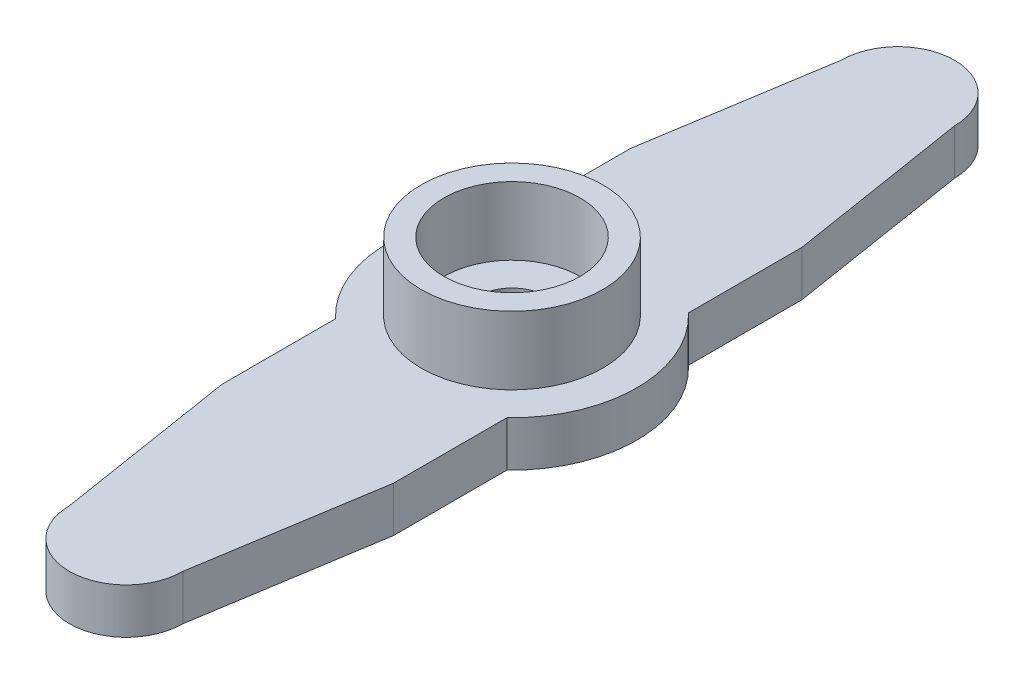
ISO-10303-21;
HEADER;
FILE_DESCRIPTION(('STEP AP214'),'2;1');
FILE_NAME('part.step','',(''),(''),'','','');
FILE_SCHEMA(('AUTOMOTIVE_DESIGN { 1 0 10303 214 1 1 1 1 }'));
ENDSEC;
DATA;
#1=APPLICATION_CONTEXT('core data for automotive mechanical design processes');
#2=APPLICATION_PROTOCOL_DEFINITION('international standard','automotive_design',2000,#1);
#3=PRODUCT_CONTEXT('',#1,'mechanical');
#4=PRODUCT('Part','Part','',(#3));
#5=PRODUCT_RELATED_PRODUCT_CATEGORY('part','',(#4));
#6=PRODUCT_DEFINITION_FORMATION('','',#4);
#7=PRODUCT_DEFINITION_CONTEXT('part definition',#1,'design');
#8=PRODUCT_DEFINITION('design','',#6,#7);
#9=PRODUCT_DEFINITION_SHAPE('','',#8);
#10=(LENGTH_UNIT() NAMED_UNIT(*) SI_UNIT(.MILLI.,.METRE.));
#11=(NAMED_UNIT(*) PLANE_ANGLE_UNIT() SI_UNIT($,.RADIAN.));
#12=(NAMED_UNIT(*) SI_UNIT($,.STERADIAN.) SOLID_ANGLE_UNIT());
#13=UNCERTAINTY_MEASURE_WITH_UNIT(LENGTH_MEASURE(1.E-05),#10,'distance_accuracy_value','');
#14=(GEOMETRIC_REPRESENTATION_CONTEXT(3) GLOBAL_UNCERTAINTY_ASSIGNED_CONTEXT((#13)) GLOBAL_UNIT_ASSIGNED_CONTEXT((#10,
#11,#12)) REPRESENTATION_CONTEXT('',''));
#15=CARTESIAN_POINT('',(0.,0.,0.));
#16=DIRECTION('',(0.,0.,1.));
#17=DIRECTION('',(1.,0.,0.));
#18=AXIS2_PLACEMENT_3D('',#15,#16,#17);
#19=CARTESIAN_POINT('',(0.,2.,0.));
#20=DIRECTION('',(0.,1.,0.));
#21=DIRECTION('',(0.,0.,1.));
#22=AXIS2_PLACEMENT_3D('',#19,#20,#21);
#23=PLANE('',#22);
#24=CARTESIAN_POINT('',(0.,2.,0.));
#25=DIRECTION('',(0.,1.,0.));
#26=DIRECTION('',(0.,0.,1.));
#27=AXIS2_PLACEMENT_3D('',#24,#25,#26);
#28=CIRCLE('',#27,1.5);
#29=CARTESIAN_POINT('',(0.,2.,1.5));
#30=VERTEX_POINT('',#29);
#31=EDGE_CURVE('E166',#30,#30,#28,.T.);
#32=ORIENTED_EDGE('',*,*,#31,.F.);
#33=EDGE_LOOP('',(#32));
#34=FACE_BOUND('',#33,.T.);
#35=CARTESIAN_POINT('',(0.,2.,0.));
#36=DIRECTION('',(0.,1.,0.));
#37=DIRECTION('',(0.,0.,1.));
#38=AXIS2_PLACEMENT_3D('',#35,#36,#37);
#39=CIRCLE('',#38,3.);
#40=CARTESIAN_POINT('',(0.,2.,3.));
#41=VERTEX_POINT('',#40);
#42=EDGE_CURVE('E11',#41,#41,#39,.F.);
#43=ORIENTED_EDGE('',*,*,#42,.F.);
#44=EDGE_LOOP('',(#43));
#45=FACE_BOUND('',#44,.T.);
#46=ADVANCED_FACE('F45',(#34,#45),#23,.T.);
#47=CARTESIAN_POINT('',(0.,2.,-17.));
#48=DIRECTION('',(0.,-1.,0.));
#49=DIRECTION('',(0.,0.,-1.));
#50=AXIS2_PLACEMENT_3D('',#47,#48,#49);
#51=CYLINDRICAL_SURFACE('',#50,2.5);
#52=CARTESIAN_POINT('',(0.,0.,-17.));
#53=DIRECTION('',(0.,1.,0.));
#54=DIRECTION('',(0.,0.,1.));
#55=AXIS2_PLACEMENT_3D('',#52,#53,#54);
#56=CIRCLE('',#55,2.5);
#57=CARTESIAN_POINT('',(-2.5,0.,-17.));
#58=VERTEX_POINT('',#57);
#59=CARTESIAN_POINT('',(2.5,0.,-17.));
#60=VERTEX_POINT('',#59);
#61=EDGE_CURVE('E174',#58,#60,#56,.F.);
#62=ORIENTED_EDGE('',*,*,#61,.F.);
#63=DIRECTION('',(0.,-1.,0.));
#64=VECTOR('',#63,1.);
#65=CARTESIAN_POINT('',(-2.5,2.,-17.));
#66=LINE('',#65,#64);
#67=CARTESIAN_POINT('',(-2.5,2.,-17.));
#68=VERTEX_POINT('',#67);
#69=EDGE_CURVE('E55',#68,#58,#66,.T.);
#70=ORIENTED_EDGE('',*,*,#69,.F.);
#71=CARTESIAN_POINT('',(0.,2.,-17.));
#72=DIRECTION('',(0.,1.,0.));
#73=DIRECTION('',(0.,0.,1.));
#74=AXIS2_PLACEMENT_3D('',#71,#72,#73);
#75=CIRCLE('',#74,2.5);
#76=CARTESIAN_POINT('',(2.5,2.,-17.));
#77=VERTEX_POINT('',#76);
#78=EDGE_CURVE('E217',#68,#77,#75,.F.);
#79=ORIENTED_EDGE('',*,*,#78,.T.);
#80=DIRECTION('',(0.,-1.,0.));
#81=VECTOR('',#80,1.);
#82=CARTESIAN_POINT('',(2.5,2.,-17.));
#83=LINE('',#82,#81);
#84=EDGE_CURVE('E111',#77,#60,#83,.T.);
#85=ORIENTED_EDGE('',*,*,#84,.T.);
#86=EDGE_LOOP('',(#62,#70,#79,#85));
#87=FACE_BOUND('',#86,.T.);
#88=ADVANCED_FACE('F47',(#87),#51,.T.);
#89=CARTESIAN_POINT('',(-5.08017735394957,2.,-0.80960069714895));
#90=DIRECTION('',(-0.987538325447718,0.,-0.157378701773512));
#91=DIRECTION('',(-0.157378701773512,0.,0.987538325447718));
#92=AXIS2_PLACEMENT_3D('',#89,#90,#91);
#93=PLANE('',#92);
#94=DIRECTION('',(0.157378701773512,0.,-0.987538325447718));
#95=VECTOR('',#94,1.);
#96=CARTESIAN_POINT('',(-5.08017735394957,0.,-0.80960069714895));
#97=LINE('',#96,#95);
#98=CARTESIAN_POINT('',(-3.77491721763537,0.,-9.));
#99=VERTEX_POINT('',#98);
#100=EDGE_CURVE('E178',#99,#58,#97,.T.);
#101=ORIENTED_EDGE('',*,*,#100,.F.);
#102=DIRECTION('',(0.,-1.,0.));
#103=VECTOR('',#102,1.);
#104=CARTESIAN_POINT('',(-3.77491721763537,2.,-9.));
#105=LINE('',#104,#103);
#106=CARTESIAN_POINT('',(-3.77491721763537,2.,-9.));
#107=VERTEX_POINT('',#106);
#108=EDGE_CURVE('E245',#107,#99,#105,.T.);
#109=ORIENTED_EDGE('',*,*,#108,.F.);
#110=DIRECTION('',(0.157378701773512,0.,-0.987538325447718));
#111=VECTOR('',#110,1.);
#112=CARTESIAN_POINT('',(-5.08017735394957,2.,-0.80960069714895));
#113=LINE('',#112,#111);
#114=EDGE_CURVE('E253',#107,#68,#113,.T.);
#115=ORIENTED_EDGE('',*,*,#114,.T.);
#116=ORIENTED_EDGE('',*,*,#69,.T.);
#117=EDGE_LOOP('',(#101,#109,#115,#116));
#118=FACE_BOUND('',#117,.T.);
#119=ADVANCED_FACE('F251',(#118),#93,.T.);
#120=CARTESIAN_POINT('',(-3.77491721763537,2.,0.));
#121=DIRECTION('',(-1.,0.,0.));
#122=DIRECTION('',(0.,0.,1.));
#123=AXIS2_PLACEMENT_3D('',#120,#121,#122);
#124=PLANE('',#123);
#125=DIRECTION('',(0.,0.,-1.));
#126=VECTOR('',#125,1.);
#127=CARTESIAN_POINT('',(-3.77491721763537,0.,0.));
#128=LINE('',#127,#126);
#129=CARTESIAN_POINT('',(-3.77491721763537,0.,-4.));
#130=VERTEX_POINT('',#129);
#131=EDGE_CURVE('E183',#130,#99,#128,.T.);
#132=ORIENTED_EDGE('',*,*,#131,.F.);
#133=DIRECTION('',(0.,-1.,0.));
#134=VECTOR('',#133,1.);
#135=CARTESIAN_POINT('',(-3.77491721763537,2.,-4.));
#136=LINE('',#135,#134);
#137=CARTESIAN_POINT('',(-3.77491721763537,2.,-4.));
#138=VERTEX_POINT('',#137);
#139=EDGE_CURVE('E242',#138,#130,#136,.T.);
#140=ORIENTED_EDGE('',*,*,#139,.F.);
#141=DIRECTION('',(0.,0.,-1.));
#142=VECTOR('',#141,1.);
#143=CARTESIAN_POINT('',(-3.77491721763537,2.,0.));
#144=LINE('',#143,#142);
#145=EDGE_CURVE('E266',#138,#107,#144,.T.);
#146=ORIENTED_EDGE('',*,*,#145,.T.);
#147=ORIENTED_EDGE('',*,*,#108,.T.);
#148=EDGE_LOOP('',(#132,#140,#146,#147));
#149=FACE_BOUND('',#148,.T.);
#150=ADVANCED_FACE('F262',(#149),#124,.T.);
#151=CARTESIAN_POINT('',(0.,2.,0.));
#152=DIRECTION('',(0.,-1.,0.));
#153=DIRECTION('',(0.,0.,-1.));
#154=AXIS2_PLACEMENT_3D('',#151,#152,#153);
#155=CYLINDRICAL_SURFACE('',#154,5.5);
#156=CARTESIAN_POINT('',(0.,0.,0.));
#157=DIRECTION('',(0.,1.,0.));
#158=DIRECTION('',(0.,0.,1.));
#159=AXIS2_PLACEMENT_3D('',#156,#157,#158);
#160=CIRCLE('',#159,5.5);
#161=CARTESIAN_POINT('',(-3.77491721763539,0.,4.));
#162=VERTEX_POINT('',#161);
#163=EDGE_CURVE('E187',#130,#162,#160,.T.);
#164=ORIENTED_EDGE('',*,*,#163,.T.);
#165=DIRECTION('',(0.,-1.,0.));
#166=VECTOR('',#165,1.);
#167=CARTESIAN_POINT('',(-3.77491721763539,2.,4.));
#168=LINE('',#167,#166);
#169=CARTESIAN_POINT('',(-3.77491721763539,2.,4.));
#170=VERTEX_POINT('',#169);
#171=EDGE_CURVE('E238',#170,#162,#168,.T.);
#172=ORIENTED_EDGE('',*,*,#171,.F.);
#173=CARTESIAN_POINT('',(0.,2.,0.));
#174=DIRECTION('',(0.,1.,0.));
#175=DIRECTION('',(0.,0.,1.));
#176=AXIS2_PLACEMENT_3D('',#173,#174,#175);
#177=CIRCLE('',#176,5.5);
#178=EDGE_CURVE('E153',#138,#170,#177,.T.);
#179=ORIENTED_EDGE('',*,*,#178,.F.);
#180=ORIENTED_EDGE('',*,*,#139,.T.);
#181=EDGE_LOOP('',(#164,#172,#179,#180));
#182=FACE_BOUND('',#181,.T.);
#183=ADVANCED_FACE('F352',(#182),#155,.T.);
#184=CARTESIAN_POINT('',(-3.77491721763539,2.,0.));
#185=DIRECTION('',(1.,0.,0.));
#186=DIRECTION('',(0.,0.,-1.));
#187=AXIS2_PLACEMENT_3D('',#184,#185,#186);
#188=PLANE('',#187);
#189=DIRECTION('',(0.,0.,1.));
#190=VECTOR('',#189,1.);
#191=CARTESIAN_POINT('',(-3.77491721763539,0.,0.));
#192=LINE('',#191,#190);
#193=CARTESIAN_POINT('',(-3.77491721763539,0.,9.));
#194=VERTEX_POINT('',#193);
#195=EDGE_CURVE('E190',#162,#194,#192,.T.);
#196=ORIENTED_EDGE('',*,*,#195,.T.);
#197=DIRECTION('',(0.,-1.,0.));
#198=VECTOR('',#197,1.);
#199=CARTESIAN_POINT('',(-3.77491721763539,2.,9.));
#200=LINE('',#199,#198);
#201=CARTESIAN_POINT('',(-3.77491721763539,2.,9.));
#202=VERTEX_POINT('',#201);
#203=EDGE_CURVE('E234',#202,#194,#200,.T.);
#204=ORIENTED_EDGE('',*,*,#203,.F.);
#205=DIRECTION('',(0.,0.,1.));
#206=VECTOR('',#205,1.);
#207=CARTESIAN_POINT('',(-3.77491721763539,2.,0.));
#208=LINE('',#207,#206);
#209=EDGE_CURVE('E276',#170,#202,#208,.T.);
#210=ORIENTED_EDGE('',*,*,#209,.F.);
#211=ORIENTED_EDGE('',*,*,#171,.T.);
#212=EDGE_LOOP('',(#196,#204,#210,#211));
#213=FACE_BOUND('',#212,.T.);
#214=ADVANCED_FACE('F365',(#213),#188,.F.);
#215=CARTESIAN_POINT('',(-5.08017735394959,2.,0.809600697148963));
#216=DIRECTION('',(0.987538325447718,0.,-0.157378701773514));
#217=DIRECTION('',(-0.157378701773514,0.,-0.987538325447718));
#218=AXIS2_PLACEMENT_3D('',#215,#216,#217);
#219=PLANE('',#218);
#220=DIRECTION('',(0.157378701773514,0.,0.987538325447718));
#221=VECTOR('',#220,1.);
#222=CARTESIAN_POINT('',(-5.08017735394959,0.,0.809600697148963));
#223=LINE('',#222,#221);
#224=CARTESIAN_POINT('',(-2.5,0.,17.));
#225=VERTEX_POINT('',#224);
#226=EDGE_CURVE('E193',#194,#225,#223,.T.);
#227=ORIENTED_EDGE('',*,*,#226,.T.);
#228=DIRECTION('',(0.,-1.,0.));
#229=VECTOR('',#228,1.);
#230=CARTESIAN_POINT('',(-2.5,2.,17.));
#231=LINE('',#230,#229);
#232=CARTESIAN_POINT('',(-2.5,2.,17.));
#233=VERTEX_POINT('',#232);
#234=EDGE_CURVE('E230',#233,#225,#231,.T.);
#235=ORIENTED_EDGE('',*,*,#234,.F.);
#236=DIRECTION('',(0.157378701773514,0.,0.987538325447718));
#237=VECTOR('',#236,1.);
#238=CARTESIAN_POINT('',(-5.08017735394959,2.,0.809600697148963));
#239=LINE('',#238,#237);
#240=EDGE_CURVE('E279',#202,#233,#239,.T.);
#241=ORIENTED_EDGE('',*,*,#240,.F.);
#242=ORIENTED_EDGE('',*,*,#203,.T.);
#243=EDGE_LOOP('',(#227,#235,#241,#242));
#244=FACE_BOUND('',#243,.T.);
#245=ADVANCED_FACE('F361',(#244),#219,.F.);
#246=CARTESIAN_POINT('',(0.,2.,17.));
#247=DIRECTION('',(0.,-1.,0.));
#248=DIRECTION('',(0.,0.,-1.));
#249=AXIS2_PLACEMENT_3D('',#246,#247,#248);
#250=CYLINDRICAL_SURFACE('',#249,2.5);
#251=CARTESIAN_POINT('',(0.,0.,17.));
#252=DIRECTION('',(0.,1.,0.));
#253=DIRECTION('',(0.,0.,1.));
#254=AXIS2_PLACEMENT_3D('',#251,#252,#253);
#255=CIRCLE('',#254,2.5);
#256=CARTESIAN_POINT('',(2.5,0.,17.));
#257=VERTEX_POINT('',#256);
#258=EDGE_CURVE('E196',#225,#257,#255,.T.);
#259=ORIENTED_EDGE('',*,*,#258,.T.);
#260=DIRECTION('',(0.,-1.,0.));
#261=VECTOR('',#260,1.);
#262=CARTESIAN_POINT('',(2.5,2.,17.));
#263=LINE('',#262,#261);
#264=CARTESIAN_POINT('',(2.5,2.,17.));
#265=VERTEX_POINT('',#264);
#266=EDGE_CURVE('E227',#265,#257,#263,.T.);
#267=ORIENTED_EDGE('',*,*,#266,.F.);
#268=CARTESIAN_POINT('',(0.,2.,17.));
#269=DIRECTION('',(0.,1.,0.));
#270=DIRECTION('',(0.,0.,1.));
#271=AXIS2_PLACEMENT_3D('',#268,#269,#270);
#272=CIRCLE('',#271,2.5);
#273=EDGE_CURVE('E282',#233,#265,#272,.T.);
#274=ORIENTED_EDGE('',*,*,#273,.F.);
#275=ORIENTED_EDGE('',*,*,#234,.T.);
#276=EDGE_LOOP('',(#259,#267,#274,#275));
#277=FACE_BOUND('',#276,.T.);
#278=ADVANCED_FACE('F358',(#277),#250,.T.);
#279=CARTESIAN_POINT('',(5.08017735394955,2.,0.809600697148942));
#280=DIRECTION('',(0.987538325447719,0.,0.157378701773511));
#281=DIRECTION('',(0.157378701773511,0.,-0.987538325447719));
#282=AXIS2_PLACEMENT_3D('',#279,#280,#281);
#283=PLANE('',#282);
#284=DIRECTION('',(-0.157378701773511,0.,0.987538325447719));
#285=VECTOR('',#284,1.);
#286=CARTESIAN_POINT('',(5.08017735394955,0.,0.809600697148942));
#287=LINE('',#286,#285);
#288=CARTESIAN_POINT('',(3.77491721763536,0.,9.));
#289=VERTEX_POINT('',#288);
#290=EDGE_CURVE('E200',#289,#257,#287,.T.);
#291=ORIENTED_EDGE('',*,*,#290,.F.);
#292=DIRECTION('',(0.,-1.,0.));
#293=VECTOR('',#292,1.);
#294=CARTESIAN_POINT('',(3.77491721763536,2.,9.));
#295=LINE('',#294,#293);
#296=CARTESIAN_POINT('',(3.77491721763536,2.,9.));
#297=VERTEX_POINT('',#296);
#298=EDGE_CURVE('E224',#297,#289,#295,.T.);
#299=ORIENTED_EDGE('',*,*,#298,.F.);
#300=DIRECTION('',(-0.157378701773511,0.,0.987538325447719));
#301=VECTOR('',#300,1.);
#302=CARTESIAN_POINT('',(5.08017735394955,2.,0.809600697148942));
#303=LINE('',#302,#301);
#304=EDGE_CURVE('E284',#297,#265,#303,.T.);
#305=ORIENTED_EDGE('',*,*,#304,.T.);
#306=ORIENTED_EDGE('',*,*,#266,.T.);
#307=EDGE_LOOP('',(#291,#299,#305,#306));
#308=FACE_BOUND('',#307,.T.);
#309=ADVANCED_FACE('F355',(#308),#283,.T.);
#310=CARTESIAN_POINT('',(3.77491721763536,2.,0.));
#311=DIRECTION('',(1.,0.,0.));
#312=DIRECTION('',(0.,0.,-1.));
#313=AXIS2_PLACEMENT_3D('',#310,#311,#312);
#314=PLANE('',#313);
#315=DIRECTION('',(0.,0.,1.));
#316=VECTOR('',#315,1.);
#317=CARTESIAN_POINT('',(3.77491721763536,0.,0.));
#318=LINE('',#317,#316);
#319=CARTESIAN_POINT('',(3.77491721763536,0.,4.));
#320=VERTEX_POINT('',#319);
#321=EDGE_CURVE('E204',#320,#289,#318,.T.);
#322=ORIENTED_EDGE('',*,*,#321,.F.);
#323=DIRECTION('',(0.,-1.,0.));
#324=VECTOR('',#323,1.);
#325=CARTESIAN_POINT('',(3.77491721763536,2.,4.));
#326=LINE('',#325,#324);
#327=CARTESIAN_POINT('',(3.77491721763536,2.,4.));
#328=VERTEX_POINT('',#327);
#329=EDGE_CURVE('E159',#328,#320,#326,.T.);
#330=ORIENTED_EDGE('',*,*,#329,.F.);
#331=DIRECTION('',(0.,0.,1.));
#332=VECTOR('',#331,1.);
#333=CARTESIAN_POINT('',(3.77491721763536,2.,0.));
#334=LINE('',#333,#332);
#335=EDGE_CURVE('E149',#328,#297,#334,.T.);
#336=ORIENTED_EDGE('',*,*,#335,.T.);
#337=ORIENTED_EDGE('',*,*,#298,.T.);
#338=EDGE_LOOP('',(#322,#330,#336,#337));
#339=FACE_BOUND('',#338,.T.);
#340=ADVANCED_FACE('F291',(#339),#314,.T.);
#341=CARTESIAN_POINT('',(3.77491721763537,0.,-4.));
#342=VERTEX_POINT('',#341);
#343=EDGE_CURVE('E157',#320,#342,#160,.T.);
#344=ORIENTED_EDGE('',*,*,#343,.T.);
#345=DIRECTION('',(0.,-1.,0.));
#346=VECTOR('',#345,1.);
#347=CARTESIAN_POINT('',(3.77491721763537,2.,-4.));
#348=LINE('',#347,#346);
#349=CARTESIAN_POINT('',(3.77491721763537,2.,-4.));
#350=VERTEX_POINT('',#349);
#351=EDGE_CURVE('E154',#350,#342,#348,.T.);
#352=ORIENTED_EDGE('',*,*,#351,.F.);
#353=EDGE_CURVE('E142',#328,#350,#177,.T.);
#354=ORIENTED_EDGE('',*,*,#353,.F.);
#355=ORIENTED_EDGE('',*,*,#329,.T.);
#356=EDGE_LOOP('',(#344,#352,#354,#355));
#357=FACE_BOUND('',#356,.T.);
#358=ADVANCED_FACE('F155',(#357),#155,.T.);
#359=CARTESIAN_POINT('',(3.77491721763537,2.,0.));
#360=DIRECTION('',(-1.,0.,0.));
#361=DIRECTION('',(0.,0.,1.));
#362=AXIS2_PLACEMENT_3D('',#359,#360,#361);
#363=PLANE('',#362);
#364=DIRECTION('',(0.,0.,-1.));
#365=VECTOR('',#364,1.);
#366=CARTESIAN_POINT('',(3.77491721763537,0.,0.));
#367=LINE('',#366,#365);
#368=CARTESIAN_POINT('',(3.77491721763537,0.,-9.));
#369=VERTEX_POINT('',#368);
#370=EDGE_CURVE('E104',#342,#369,#367,.T.);
#371=ORIENTED_EDGE('',*,*,#370,.T.);
#372=DIRECTION('',(0.,-1.,0.));
#373=VECTOR('',#372,1.);
#374=CARTESIAN_POINT('',(3.77491721763537,2.,-9.));
#375=LINE('',#374,#373);
#376=CARTESIAN_POINT('',(3.77491721763537,2.,-9.));
#377=VERTEX_POINT('',#376);
#378=EDGE_CURVE('E160',#377,#369,#375,.T.);
#379=ORIENTED_EDGE('',*,*,#378,.F.);
#380=DIRECTION('',(0.,0.,-1.));
#381=VECTOR('',#380,1.);
#382=CARTESIAN_POINT('',(3.77491721763537,2.,0.));
#383=LINE('',#382,#381);
#384=EDGE_CURVE('E146',#350,#377,#383,.T.);
#385=ORIENTED_EDGE('',*,*,#384,.F.);
#386=ORIENTED_EDGE('',*,*,#351,.T.);
#387=EDGE_LOOP('',(#371,#379,#385,#386));
#388=FACE_BOUND('',#387,.T.);
#389=ADVANCED_FACE('F162',(#388),#363,.F.);
#390=CARTESIAN_POINT('',(5.08017735394957,2.,-0.809600697148955));
#391=DIRECTION('',(-0.987538325447718,0.,0.157378701773513));
#392=DIRECTION('',(0.157378701773513,0.,0.987538325447718));
#393=AXIS2_PLACEMENT_3D('',#390,#391,#392);
#394=PLANE('',#393);
#395=DIRECTION('',(-0.157378701773513,0.,-0.987538325447718));
#396=VECTOR('',#395,1.);
#397=CARTESIAN_POINT('',(5.08017735394957,0.,-0.809600697148955));
#398=LINE('',#397,#396);
#399=EDGE_CURVE('E210',#369,#60,#398,.T.);
#400=ORIENTED_EDGE('',*,*,#399,.T.);
#401=ORIENTED_EDGE('',*,*,#84,.F.);
#402=DIRECTION('',(-0.157378701773513,0.,-0.987538325447718));
#403=VECTOR('',#402,1.);
#404=CARTESIAN_POINT('',(5.08017735394957,2.,-0.809600697148955));
#405=LINE('',#404,#403);
#406=EDGE_CURVE('E63',#377,#77,#405,.T.);
#407=ORIENTED_EDGE('',*,*,#406,.F.);
#408=ORIENTED_EDGE('',*,*,#378,.T.);
#409=EDGE_LOOP('',(#400,#401,#407,#408));
#410=FACE_BOUND('',#409,.T.);
#411=ADVANCED_FACE('F336',(#410),#394,.F.);
#412=CARTESIAN_POINT('',(0.,2.,0.));
#413=DIRECTION('',(0.,-1.,0.));
#414=DIRECTION('',(0.,0.,-1.));
#415=AXIS2_PLACEMENT_3D('',#412,#413,#414);
#416=CYLINDRICAL_SURFACE('',#415,1.5);
#417=ORIENTED_EDGE('',*,*,#31,.T.);
#418=EDGE_LOOP('',(#417));
#419=FACE_BOUND('',#418,.T.);
#420=CARTESIAN_POINT('',(0.,0.,0.));
#421=DIRECTION('',(0.,1.,0.));
#422=DIRECTION('',(0.,0.,1.));
#423=AXIS2_PLACEMENT_3D('',#420,#421,#422);
#424=CIRCLE('',#423,1.5);
#425=CARTESIAN_POINT('',(0.,0.,1.5));
#426=VERTEX_POINT('',#425);
#427=EDGE_CURVE('E213',#426,#426,#424,.T.);
#428=ORIENTED_EDGE('',*,*,#427,.F.);
#429=EDGE_LOOP('',(#428));
#430=FACE_BOUND('',#429,.T.);
#431=ADVANCED_FACE('F331',(#419,#430),#416,.F.);
#432=CARTESIAN_POINT('',(0.,2.,0.));
#433=DIRECTION('',(0.,1.,0.));
#434=DIRECTION('',(0.,0.,1.));
#435=AXIS2_PLACEMENT_3D('',#432,#433,#434);
#436=CIRCLE('',#435,4.);
#437=CARTESIAN_POINT('',(0.,2.,4.));
#438=VERTEX_POINT('',#437);
#439=EDGE_CURVE('E297',#438,#438,#436,.T.);
#440=ORIENTED_EDGE('',*,*,#439,.F.);
#441=EDGE_LOOP('',(#440));
#442=FACE_BOUND('',#441,.T.);
#443=ORIENTED_EDGE('',*,*,#78,.F.);
#444=ORIENTED_EDGE('',*,*,#114,.F.);
#445=ORIENTED_EDGE('',*,*,#145,.F.);
#446=ORIENTED_EDGE('',*,*,#178,.T.);
#447=ORIENTED_EDGE('',*,*,#209,.T.);
#448=ORIENTED_EDGE('',*,*,#240,.T.);
#449=ORIENTED_EDGE('',*,*,#273,.T.);
#450=ORIENTED_EDGE('',*,*,#304,.F.);
#451=ORIENTED_EDGE('',*,*,#335,.F.);
#452=ORIENTED_EDGE('',*,*,#353,.T.);
#453=ORIENTED_EDGE('',*,*,#384,.T.);
#454=ORIENTED_EDGE('',*,*,#406,.T.);
#455=EDGE_LOOP('',(#443,#444,#445,#446,#447,#448,#449,#450,#451,#452,#453,#454));
#456=FACE_BOUND('',#455,.T.);
#457=ADVANCED_FACE('F144',(#442,#456),#23,.T.);
#458=CARTESIAN_POINT('',(0.,0.,0.));
#459=DIRECTION('',(0.,1.,0.));
#460=DIRECTION('',(0.,0.,1.));
#461=AXIS2_PLACEMENT_3D('',#458,#459,#460);
#462=PLANE('',#461);
#463=ORIENTED_EDGE('',*,*,#61,.T.);
#464=ORIENTED_EDGE('',*,*,#399,.F.);
#465=ORIENTED_EDGE('',*,*,#370,.F.);
#466=ORIENTED_EDGE('',*,*,#343,.F.);
#467=ORIENTED_EDGE('',*,*,#321,.T.);
#468=ORIENTED_EDGE('',*,*,#290,.T.);
#469=ORIENTED_EDGE('',*,*,#258,.F.);
#470=ORIENTED_EDGE('',*,*,#226,.F.);
#471=ORIENTED_EDGE('',*,*,#195,.F.);
#472=ORIENTED_EDGE('',*,*,#163,.F.);
#473=ORIENTED_EDGE('',*,*,#131,.T.);
#474=ORIENTED_EDGE('',*,*,#100,.T.);
#475=EDGE_LOOP('',(#463,#464,#465,#466,#467,#468,#469,#470,#471,#472,#473,#474));
#476=FACE_BOUND('',#475,.T.);
#477=ORIENTED_EDGE('',*,*,#427,.T.);
#478=EDGE_LOOP('',(#477));
#479=FACE_BOUND('',#478,.T.);
#480=ADVANCED_FACE('F256',(#476,#479),#462,.F.);
#481=CARTESIAN_POINT('',(0.,5.,0.));
#482=DIRECTION('',(0.,1.,0.));
#483=DIRECTION('',(0.,0.,1.));
#484=AXIS2_PLACEMENT_3D('',#481,#482,#483);
#485=PLANE('',#484);
#486=CARTESIAN_POINT('',(0.,5.,0.));
#487=DIRECTION('',(0.,1.,0.));
#488=DIRECTION('',(0.,0.,1.));
#489=AXIS2_PLACEMENT_3D('',#486,#487,#488);
#490=CIRCLE('',#489,4.);
#491=CARTESIAN_POINT('',(0.,5.,4.));
#492=VERTEX_POINT('',#491);
#493=EDGE_CURVE('E179',#492,#492,#490,.T.);
#494=ORIENTED_EDGE('',*,*,#493,.T.);
#495=EDGE_LOOP('',(#494));
#496=FACE_BOUND('',#495,.T.);
#497=CARTESIAN_POINT('',(0.,5.,0.));
#498=DIRECTION('',(0.,1.,0.));
#499=DIRECTION('',(0.,0.,1.));
#500=AXIS2_PLACEMENT_3D('',#497,#498,#499);
#501=CIRCLE('',#500,3.);
#502=CARTESIAN_POINT('',(0.,5.,3.));
#503=VERTEX_POINT('',#502);
#504=EDGE_CURVE('E301',#503,#503,#501,.T.);
#505=ORIENTED_EDGE('',*,*,#504,.F.);
#506=EDGE_LOOP('',(#505));
#507=FACE_BOUND('',#506,.T.);
#508=ADVANCED_FACE('F309',(#496,#507),#485,.T.);
#509=CARTESIAN_POINT('',(0.,5.,0.));
#510=DIRECTION('',(0.,-1.,0.));
#511=DIRECTION('',(0.,0.,-1.));
#512=AXIS2_PLACEMENT_3D('',#509,#510,#511);
#513=CYLINDRICAL_SURFACE('',#512,4.);
#514=ORIENTED_EDGE('',*,*,#493,.F.);
#515=EDGE_LOOP('',(#514));
#516=FACE_BOUND('',#515,.T.);
#517=ORIENTED_EDGE('',*,*,#439,.T.);
#518=EDGE_LOOP('',(#517));
#519=FACE_BOUND('',#518,.T.);
#520=ADVANCED_FACE('F311',(#516,#519),#513,.T.);
#521=CARTESIAN_POINT('',(0.,5.,0.));
#522=DIRECTION('',(0.,-1.,0.));
#523=DIRECTION('',(0.,0.,-1.));
#524=AXIS2_PLACEMENT_3D('',#521,#522,#523);
#525=CYLINDRICAL_SURFACE('',#524,3.);
#526=ORIENTED_EDGE('',*,*,#504,.T.);
#527=EDGE_LOOP('',(#526));
#528=FACE_BOUND('',#527,.T.);
#529=ORIENTED_EDGE('',*,*,#42,.T.);
#530=EDGE_LOOP('',(#529));
#531=FACE_BOUND('',#530,.T.);
#532=ADVANCED_FACE('F306',(#528,#531),#525,.F.);
#533=CLOSED_SHELL('',(#46,#88,#119,#150,#183,#214,#245,#278,#309,#340,#358,#389,#411,#431,#457,
#480,#508,#520,#532));
#534=MANIFOLD_SOLID_BREP('B2',#533);
#535=ADVANCED_BREP_SHAPE_REPRESENTATION('',(#18,#534),#14);
#536=SHAPE_DEFINITION_REPRESENTATION(#9,#535);
ENDSEC;
END-ISO-10303-21;
